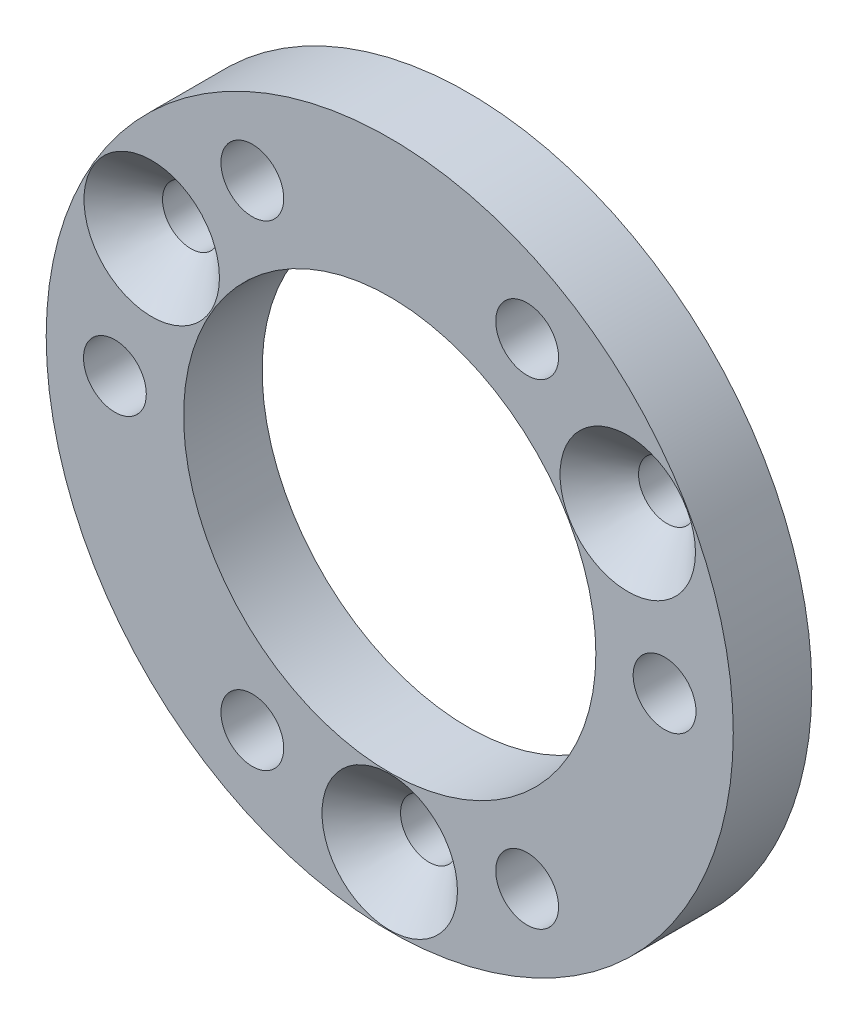
ISO-10303-21;
HEADER;
FILE_DESCRIPTION(('STEP AP214'),'2;1');
FILE_NAME('part.step','',(''),(''),'','','');
FILE_SCHEMA(('AUTOMOTIVE_DESIGN { 1 0 10303 214 1 1 1 1 }'));
ENDSEC;
DATA;
#1=APPLICATION_CONTEXT('core data for automotive mechanical design processes');
#2=APPLICATION_PROTOCOL_DEFINITION('international standard','automotive_design',2000,#1);
#3=PRODUCT_CONTEXT('',#1,'mechanical');
#4=PRODUCT('Part','Part','',(#3));
#5=PRODUCT_RELATED_PRODUCT_CATEGORY('part','',(#4));
#6=PRODUCT_DEFINITION_FORMATION('','',#4);
#7=PRODUCT_DEFINITION_CONTEXT('part definition',#1,'design');
#8=PRODUCT_DEFINITION('design','',#6,#7);
#9=PRODUCT_DEFINITION_SHAPE('','',#8);
#10=(LENGTH_UNIT() NAMED_UNIT(*) SI_UNIT(.MILLI.,.METRE.));
#11=(NAMED_UNIT(*) PLANE_ANGLE_UNIT() SI_UNIT($,.RADIAN.));
#12=(NAMED_UNIT(*) SI_UNIT($,.STERADIAN.) SOLID_ANGLE_UNIT());
#13=UNCERTAINTY_MEASURE_WITH_UNIT(LENGTH_MEASURE(1.E-05),#10,'distance_accuracy_value','');
#14=(GEOMETRIC_REPRESENTATION_CONTEXT(3) GLOBAL_UNCERTAINTY_ASSIGNED_CONTEXT((#13)) GLOBAL_UNIT_ASSIGNED_CONTEXT((#10,
#11,#12)) REPRESENTATION_CONTEXT('',''));
#15=CARTESIAN_POINT('',(0.,0.,0.));
#16=DIRECTION('',(0.,0.,1.));
#17=DIRECTION('',(1.,0.,0.));
#18=AXIS2_PLACEMENT_3D('',#15,#16,#17);
#19=CARTESIAN_POINT('',(0.,0.,4.));
#20=DIRECTION('',(0.,0.,-1.));
#21=DIRECTION('',(-1.,0.,0.));
#22=AXIS2_PLACEMENT_3D('',#19,#20,#21);
#23=CYLINDRICAL_SURFACE('',#22,17.5);
#24=CARTESIAN_POINT('',(0.,0.,4.));
#25=DIRECTION('',(0.,0.,1.));
#26=DIRECTION('',(1.,0.,0.));
#27=AXIS2_PLACEMENT_3D('',#24,#25,#26);
#28=CIRCLE('',#27,17.5);
#29=CARTESIAN_POINT('',(17.5,0.,4.));
#30=VERTEX_POINT('',#29);
#31=EDGE_CURVE('E72',#30,#30,#28,.T.);
#32=ORIENTED_EDGE('',*,*,#31,.F.);
#33=EDGE_LOOP('',(#32));
#34=FACE_BOUND('',#33,.T.);
#35=CARTESIAN_POINT('',(0.,0.,0.));
#36=DIRECTION('',(0.,0.,1.));
#37=DIRECTION('',(1.,0.,0.));
#38=AXIS2_PLACEMENT_3D('',#35,#36,#37);
#39=CIRCLE('',#38,17.5);
#40=CARTESIAN_POINT('',(17.5,0.,0.));
#41=VERTEX_POINT('',#40);
#42=EDGE_CURVE('E73',#41,#41,#39,.T.);
#43=ORIENTED_EDGE('',*,*,#42,.T.);
#44=EDGE_LOOP('',(#43));
#45=FACE_BOUND('',#44,.T.);
#46=ADVANCED_FACE('F39',(#34,#45),#23,.T.);
#47=CARTESIAN_POINT('',(0.,0.,4.));
#48=DIRECTION('',(0.,0.,1.));
#49=DIRECTION('',(1.,0.,0.));
#50=AXIS2_PLACEMENT_3D('',#47,#48,#49);
#51=PLANE('',#50);
#52=CARTESIAN_POINT('',(-12.1243556529822,6.99999999999762,4.));
#53=DIRECTION('',(0.,0.,1.));
#54=DIRECTION('',(1.,0.,0.));
#55=AXIS2_PLACEMENT_3D('',#52,#53,#54);
#56=CIRCLE('',#55,3.45000000000165);
#57=CARTESIAN_POINT('',(-8.67435565298051,6.99999999999762,4.));
#58=VERTEX_POINT('',#57);
#59=EDGE_CURVE('E53',#58,#58,#56,.F.);
#60=ORIENTED_EDGE('',*,*,#59,.T.);
#61=EDGE_LOOP('',(#60));
#62=FACE_BOUND('',#61,.T.);
#63=CARTESIAN_POINT('',(2.05615353129625E-12,-14.0000000000012,4.));
#64=DIRECTION('',(0.,0.,1.));
#65=DIRECTION('',(1.,0.,0.));
#66=AXIS2_PLACEMENT_3D('',#63,#64,#65);
#67=CIRCLE('',#66,3.44999999999932);
#68=CARTESIAN_POINT('',(3.45000000000138,-14.0000000000012,4.));
#69=VERTEX_POINT('',#68);
#70=EDGE_CURVE('E58',#69,#69,#67,.F.);
#71=ORIENTED_EDGE('',*,*,#70,.T.);
#72=EDGE_LOOP('',(#71));
#73=FACE_BOUND('',#72,.T.);
#74=CARTESIAN_POINT('',(12.1243556529821,7.00000000000002,4.));
#75=DIRECTION('',(0.,0.,1.));
#76=DIRECTION('',(1.,0.,0.));
#77=AXIS2_PLACEMENT_3D('',#74,#75,#76);
#78=CIRCLE('',#77,3.45000000000002);
#79=CARTESIAN_POINT('',(15.5743556529821,7.00000000000002,4.));
#80=VERTEX_POINT('',#79);
#81=EDGE_CURVE('E64',#80,#80,#78,.F.);
#82=ORIENTED_EDGE('',*,*,#81,.T.);
#83=EDGE_LOOP('',(#82));
#84=FACE_BOUND('',#83,.T.);
#85=CARTESIAN_POINT('',(14.,0.,4.));
#86=DIRECTION('',(0.,0.,1.));
#87=DIRECTION('',(1.,0.,0.));
#88=AXIS2_PLACEMENT_3D('',#85,#86,#87);
#89=CIRCLE('',#88,1.6);
#90=CARTESIAN_POINT('',(15.6,0.,4.));
#91=VERTEX_POINT('',#90);
#92=EDGE_CURVE('E122',#91,#91,#89,.T.);
#93=ORIENTED_EDGE('',*,*,#92,.F.);
#94=EDGE_LOOP('',(#93));
#95=FACE_BOUND('',#94,.T.);
#96=CARTESIAN_POINT('',(7.00000000000014,12.1243556529821,4.));
#97=DIRECTION('',(0.,0.,1.));
#98=DIRECTION('',(1.,0.,0.));
#99=AXIS2_PLACEMENT_3D('',#96,#97,#98);
#100=CIRCLE('',#99,1.6);
#101=CARTESIAN_POINT('',(8.60000000000014,12.1243556529821,4.));
#102=VERTEX_POINT('',#101);
#103=EDGE_CURVE('E123',#102,#102,#100,.T.);
#104=ORIENTED_EDGE('',*,*,#103,.F.);
#105=EDGE_LOOP('',(#104));
#106=FACE_BOUND('',#105,.T.);
#107=CARTESIAN_POINT('',(-6.99999999999989,12.1243556529822,4.));
#108=DIRECTION('',(0.,0.,1.));
#109=DIRECTION('',(1.,0.,0.));
#110=AXIS2_PLACEMENT_3D('',#107,#108,#109);
#111=CIRCLE('',#110,1.6);
#112=CARTESIAN_POINT('',(-5.39999999999989,12.1243556529822,4.));
#113=VERTEX_POINT('',#112);
#114=EDGE_CURVE('E89',#113,#113,#111,.T.);
#115=ORIENTED_EDGE('',*,*,#114,.F.);
#116=EDGE_LOOP('',(#115));
#117=FACE_BOUND('',#116,.T.);
#118=CARTESIAN_POINT('',(-14.,0.,4.));
#119=DIRECTION('',(0.,0.,1.));
#120=DIRECTION('',(1.,0.,0.));
#121=AXIS2_PLACEMENT_3D('',#118,#119,#120);
#122=CIRCLE('',#121,1.6);
#123=CARTESIAN_POINT('',(-12.4,0.,4.));
#124=VERTEX_POINT('',#123);
#125=EDGE_CURVE('E98',#124,#124,#122,.T.);
#126=ORIENTED_EDGE('',*,*,#125,.F.);
#127=EDGE_LOOP('',(#126));
#128=FACE_BOUND('',#127,.T.);
#129=CARTESIAN_POINT('',(-7.00000000000006,-12.1243556529821,4.));
#130=DIRECTION('',(0.,0.,1.));
#131=DIRECTION('',(1.,0.,0.));
#132=AXIS2_PLACEMENT_3D('',#129,#130,#131);
#133=CIRCLE('',#132,1.6);
#134=CARTESIAN_POINT('',(-5.40000000000006,-12.1243556529821,4.));
#135=VERTEX_POINT('',#134);
#136=EDGE_CURVE('E106',#135,#135,#133,.T.);
#137=ORIENTED_EDGE('',*,*,#136,.F.);
#138=EDGE_LOOP('',(#137));
#139=FACE_BOUND('',#138,.T.);
#140=CARTESIAN_POINT('',(6.99999999999997,-12.1243556529822,4.));
#141=DIRECTION('',(0.,0.,1.));
#142=DIRECTION('',(1.,0.,0.));
#143=AXIS2_PLACEMENT_3D('',#140,#141,#142);
#144=CIRCLE('',#143,1.6);
#145=CARTESIAN_POINT('',(8.59999999999997,-12.1243556529822,4.));
#146=VERTEX_POINT('',#145);
#147=EDGE_CURVE('E114',#146,#146,#144,.T.);
#148=ORIENTED_EDGE('',*,*,#147,.F.);
#149=EDGE_LOOP('',(#148));
#150=FACE_BOUND('',#149,.T.);
#151=CARTESIAN_POINT('',(0.,0.,4.));
#152=DIRECTION('',(0.,0.,1.));
#153=DIRECTION('',(1.,0.,0.));
#154=AXIS2_PLACEMENT_3D('',#151,#152,#153);
#155=CIRCLE('',#154,10.5);
#156=CARTESIAN_POINT('',(10.5,0.,4.));
#157=VERTEX_POINT('',#156);
#158=EDGE_CURVE('E81',#157,#157,#155,.T.);
#159=ORIENTED_EDGE('',*,*,#158,.F.);
#160=EDGE_LOOP('',(#159));
#161=FACE_BOUND('',#160,.T.);
#162=ORIENTED_EDGE('',*,*,#31,.T.);
#163=EDGE_LOOP('',(#162));
#164=FACE_BOUND('',#163,.T.);
#165=ADVANCED_FACE('F167',(#62,#73,#84,#95,#106,#117,#128,#139,#150,#161,#164),#51,.T.);
#166=CARTESIAN_POINT('',(0.,0.,0.));
#167=DIRECTION('',(0.,0.,1.));
#168=DIRECTION('',(1.,0.,0.));
#169=AXIS2_PLACEMENT_3D('',#166,#167,#168);
#170=PLANE('',#169);
#171=CARTESIAN_POINT('',(12.1243556529821,7.00000000000002,0.));
#172=DIRECTION('',(0.,0.,1.));
#173=DIRECTION('',(1.,0.,0.));
#174=AXIS2_PLACEMENT_3D('',#171,#172,#173);
#175=CIRCLE('',#174,1.45);
#176=CARTESIAN_POINT('',(13.5743556529821,7.00000000000002,0.));
#177=VERTEX_POINT('',#176);
#178=EDGE_CURVE('E127',#177,#177,#175,.T.);
#179=ORIENTED_EDGE('',*,*,#178,.T.);
#180=EDGE_LOOP('',(#179));
#181=FACE_BOUND('',#180,.T.);
#182=CARTESIAN_POINT('',(2.05615353129625E-12,-14.0000000000012,0.));
#183=DIRECTION('',(0.,0.,1.));
#184=DIRECTION('',(1.,0.,0.));
#185=AXIS2_PLACEMENT_3D('',#182,#183,#184);
#186=CIRCLE('',#185,1.4499999999993);
#187=CARTESIAN_POINT('',(1.45000000000136,-14.0000000000012,0.));
#188=VERTEX_POINT('',#187);
#189=EDGE_CURVE('E141',#188,#188,#186,.T.);
#190=ORIENTED_EDGE('',*,*,#189,.T.);
#191=EDGE_LOOP('',(#190));
#192=FACE_BOUND('',#191,.T.);
#193=CARTESIAN_POINT('',(-12.1243556529822,6.99999999999762,0.));
#194=DIRECTION('',(0.,0.,1.));
#195=DIRECTION('',(1.,0.,0.));
#196=AXIS2_PLACEMENT_3D('',#193,#194,#195);
#197=CIRCLE('',#196,1.45000000000164);
#198=CARTESIAN_POINT('',(-10.6743556529805,6.99999999999762,0.));
#199=VERTEX_POINT('',#198);
#200=EDGE_CURVE('E137',#199,#199,#197,.T.);
#201=ORIENTED_EDGE('',*,*,#200,.T.);
#202=EDGE_LOOP('',(#201));
#203=FACE_BOUND('',#202,.T.);
#204=CARTESIAN_POINT('',(14.,0.,0.));
#205=DIRECTION('',(0.,0.,1.));
#206=DIRECTION('',(1.,0.,0.));
#207=AXIS2_PLACEMENT_3D('',#204,#205,#206);
#208=CIRCLE('',#207,1.6);
#209=CARTESIAN_POINT('',(15.6,0.,0.));
#210=VERTEX_POINT('',#209);
#211=EDGE_CURVE('E85',#210,#210,#208,.T.);
#212=ORIENTED_EDGE('',*,*,#211,.T.);
#213=EDGE_LOOP('',(#212));
#214=FACE_BOUND('',#213,.T.);
#215=CARTESIAN_POINT('',(7.00000000000014,12.1243556529821,0.));
#216=DIRECTION('',(0.,0.,1.));
#217=DIRECTION('',(1.,0.,0.));
#218=AXIS2_PLACEMENT_3D('',#215,#216,#217);
#219=CIRCLE('',#218,1.6);
#220=CARTESIAN_POINT('',(8.60000000000014,12.1243556529821,0.));
#221=VERTEX_POINT('',#220);
#222=EDGE_CURVE('E94',#221,#221,#219,.T.);
#223=ORIENTED_EDGE('',*,*,#222,.T.);
#224=EDGE_LOOP('',(#223));
#225=FACE_BOUND('',#224,.T.);
#226=CARTESIAN_POINT('',(-6.99999999999989,12.1243556529822,0.));
#227=DIRECTION('',(0.,0.,1.));
#228=DIRECTION('',(1.,0.,0.));
#229=AXIS2_PLACEMENT_3D('',#226,#227,#228);
#230=CIRCLE('',#229,1.6);
#231=CARTESIAN_POINT('',(-5.39999999999989,12.1243556529822,0.));
#232=VERTEX_POINT('',#231);
#233=EDGE_CURVE('E93',#232,#232,#230,.T.);
#234=ORIENTED_EDGE('',*,*,#233,.T.);
#235=EDGE_LOOP('',(#234));
#236=FACE_BOUND('',#235,.T.);
#237=CARTESIAN_POINT('',(-14.,0.,0.));
#238=DIRECTION('',(0.,0.,1.));
#239=DIRECTION('',(1.,0.,0.));
#240=AXIS2_PLACEMENT_3D('',#237,#238,#239);
#241=CIRCLE('',#240,1.6);
#242=CARTESIAN_POINT('',(-12.4,0.,0.));
#243=VERTEX_POINT('',#242);
#244=EDGE_CURVE('E102',#243,#243,#241,.T.);
#245=ORIENTED_EDGE('',*,*,#244,.T.);
#246=EDGE_LOOP('',(#245));
#247=FACE_BOUND('',#246,.T.);
#248=CARTESIAN_POINT('',(-7.00000000000006,-12.1243556529821,0.));
#249=DIRECTION('',(0.,0.,1.));
#250=DIRECTION('',(1.,0.,0.));
#251=AXIS2_PLACEMENT_3D('',#248,#249,#250);
#252=CIRCLE('',#251,1.6);
#253=CARTESIAN_POINT('',(-5.40000000000006,-12.1243556529821,0.));
#254=VERTEX_POINT('',#253);
#255=EDGE_CURVE('E110',#254,#254,#252,.T.);
#256=ORIENTED_EDGE('',*,*,#255,.T.);
#257=EDGE_LOOP('',(#256));
#258=FACE_BOUND('',#257,.T.);
#259=CARTESIAN_POINT('',(6.99999999999997,-12.1243556529822,0.));
#260=DIRECTION('',(0.,0.,1.));
#261=DIRECTION('',(1.,0.,0.));
#262=AXIS2_PLACEMENT_3D('',#259,#260,#261);
#263=CIRCLE('',#262,1.6);
#264=CARTESIAN_POINT('',(8.59999999999997,-12.1243556529822,0.));
#265=VERTEX_POINT('',#264);
#266=EDGE_CURVE('E118',#265,#265,#263,.T.);
#267=ORIENTED_EDGE('',*,*,#266,.T.);
#268=EDGE_LOOP('',(#267));
#269=FACE_BOUND('',#268,.T.);
#270=CARTESIAN_POINT('',(0.,0.,0.));
#271=DIRECTION('',(0.,0.,1.));
#272=DIRECTION('',(1.,0.,0.));
#273=AXIS2_PLACEMENT_3D('',#270,#271,#272);
#274=CIRCLE('',#273,10.5);
#275=CARTESIAN_POINT('',(10.5,0.,0.));
#276=VERTEX_POINT('',#275);
#277=EDGE_CURVE('E77',#276,#276,#274,.T.);
#278=ORIENTED_EDGE('',*,*,#277,.T.);
#279=EDGE_LOOP('',(#278));
#280=FACE_BOUND('',#279,.T.);
#281=ORIENTED_EDGE('',*,*,#42,.F.);
#282=EDGE_LOOP('',(#281));
#283=FACE_BOUND('',#282,.T.);
#284=ADVANCED_FACE('F149',(#181,#192,#203,#214,#225,#236,#247,#258,#269,#280,#283),#170,.F.);
#285=CARTESIAN_POINT('',(0.,0.,0.));
#286=DIRECTION('',(0.,0.,1.));
#287=DIRECTION('',(1.,0.,0.));
#288=AXIS2_PLACEMENT_3D('',#285,#286,#287);
#289=CYLINDRICAL_SURFACE('',#288,10.5);
#290=ORIENTED_EDGE('',*,*,#277,.F.);
#291=EDGE_LOOP('',(#290));
#292=FACE_BOUND('',#291,.T.);
#293=ORIENTED_EDGE('',*,*,#158,.T.);
#294=EDGE_LOOP('',(#293));
#295=FACE_BOUND('',#294,.T.);
#296=ADVANCED_FACE('F211',(#292,#295),#289,.F.);
#297=CARTESIAN_POINT('',(6.99999999999997,-12.1243556529822,0.));
#298=DIRECTION('',(0.,0.,1.));
#299=DIRECTION('',(1.,0.,0.));
#300=AXIS2_PLACEMENT_3D('',#297,#298,#299);
#301=CYLINDRICAL_SURFACE('',#300,1.6);
#302=ORIENTED_EDGE('',*,*,#266,.F.);
#303=EDGE_LOOP('',(#302));
#304=FACE_BOUND('',#303,.T.);
#305=ORIENTED_EDGE('',*,*,#147,.T.);
#306=EDGE_LOOP('',(#305));
#307=FACE_BOUND('',#306,.T.);
#308=ADVANCED_FACE('F213',(#304,#307),#301,.F.);
#309=CARTESIAN_POINT('',(-7.00000000000006,-12.1243556529821,0.));
#310=DIRECTION('',(0.,0.,1.));
#311=DIRECTION('',(1.,0.,0.));
#312=AXIS2_PLACEMENT_3D('',#309,#310,#311);
#313=CYLINDRICAL_SURFACE('',#312,1.6);
#314=ORIENTED_EDGE('',*,*,#255,.F.);
#315=EDGE_LOOP('',(#314));
#316=FACE_BOUND('',#315,.T.);
#317=ORIENTED_EDGE('',*,*,#136,.T.);
#318=EDGE_LOOP('',(#317));
#319=FACE_BOUND('',#318,.T.);
#320=ADVANCED_FACE('F220',(#316,#319),#313,.F.);
#321=CARTESIAN_POINT('',(-14.,0.,0.));
#322=DIRECTION('',(0.,0.,1.));
#323=DIRECTION('',(1.,0.,0.));
#324=AXIS2_PLACEMENT_3D('',#321,#322,#323);
#325=CYLINDRICAL_SURFACE('',#324,1.6);
#326=ORIENTED_EDGE('',*,*,#244,.F.);
#327=EDGE_LOOP('',(#326));
#328=FACE_BOUND('',#327,.T.);
#329=ORIENTED_EDGE('',*,*,#125,.T.);
#330=EDGE_LOOP('',(#329));
#331=FACE_BOUND('',#330,.T.);
#332=ADVANCED_FACE('F229',(#328,#331),#325,.F.);
#333=CARTESIAN_POINT('',(-6.99999999999989,12.1243556529822,0.));
#334=DIRECTION('',(0.,0.,1.));
#335=DIRECTION('',(1.,0.,0.));
#336=AXIS2_PLACEMENT_3D('',#333,#334,#335);
#337=CYLINDRICAL_SURFACE('',#336,1.6);
#338=ORIENTED_EDGE('',*,*,#233,.F.);
#339=EDGE_LOOP('',(#338));
#340=FACE_BOUND('',#339,.T.);
#341=ORIENTED_EDGE('',*,*,#114,.T.);
#342=EDGE_LOOP('',(#341));
#343=FACE_BOUND('',#342,.T.);
#344=ADVANCED_FACE('F225',(#340,#343),#337,.F.);
#345=CARTESIAN_POINT('',(7.00000000000014,12.1243556529821,0.));
#346=DIRECTION('',(0.,0.,1.));
#347=DIRECTION('',(1.,0.,0.));
#348=AXIS2_PLACEMENT_3D('',#345,#346,#347);
#349=CYLINDRICAL_SURFACE('',#348,1.6);
#350=ORIENTED_EDGE('',*,*,#222,.F.);
#351=EDGE_LOOP('',(#350));
#352=FACE_BOUND('',#351,.T.);
#353=ORIENTED_EDGE('',*,*,#103,.T.);
#354=EDGE_LOOP('',(#353));
#355=FACE_BOUND('',#354,.T.);
#356=ADVANCED_FACE('F228',(#352,#355),#349,.F.);
#357=CARTESIAN_POINT('',(14.,0.,0.));
#358=DIRECTION('',(0.,0.,1.));
#359=DIRECTION('',(1.,0.,0.));
#360=AXIS2_PLACEMENT_3D('',#357,#358,#359);
#361=CYLINDRICAL_SURFACE('',#360,1.6);
#362=ORIENTED_EDGE('',*,*,#211,.F.);
#363=EDGE_LOOP('',(#362));
#364=FACE_BOUND('',#363,.T.);
#365=ORIENTED_EDGE('',*,*,#92,.T.);
#366=EDGE_LOOP('',(#365));
#367=FACE_BOUND('',#366,.T.);
#368=ADVANCED_FACE('F239',(#364,#367),#361,.F.);
#369=CARTESIAN_POINT('',(-12.1243556529822,6.99999999999762,0.));
#370=DIRECTION('',(0.,0.,1.));
#371=DIRECTION('',(1.,0.,0.));
#372=AXIS2_PLACEMENT_3D('',#369,#370,#371);
#373=CYLINDRICAL_SURFACE('',#372,1.45000000000164);
#374=CARTESIAN_POINT('',(-12.1243556529822,6.99999999999762,1.99999999999999));
#375=DIRECTION('',(0.,0.,1.));
#376=DIRECTION('',(1.,0.,0.));
#377=AXIS2_PLACEMENT_3D('',#374,#375,#376);
#378=CIRCLE('',#377,1.45000000000164);
#379=CARTESIAN_POINT('',(-10.6743556529805,6.99999999999762,1.99999999999999));
#380=VERTEX_POINT('',#379);
#381=EDGE_CURVE('E68',#380,#380,#378,.T.);
#382=ORIENTED_EDGE('',*,*,#381,.T.);
#383=EDGE_LOOP('',(#382));
#384=FACE_BOUND('',#383,.T.);
#385=ORIENTED_EDGE('',*,*,#200,.F.);
#386=EDGE_LOOP('',(#385));
#387=FACE_BOUND('',#386,.T.);
#388=ADVANCED_FACE('F164',(#384,#387),#373,.F.);
#389=CARTESIAN_POINT('',(2.05615353129625E-12,-14.0000000000012,0.));
#390=DIRECTION('',(0.,0.,1.));
#391=DIRECTION('',(1.,0.,0.));
#392=AXIS2_PLACEMENT_3D('',#389,#390,#391);
#393=CYLINDRICAL_SURFACE('',#392,1.4499999999993);
#394=CARTESIAN_POINT('',(2.05615353129625E-12,-14.0000000000012,1.99999999999999));
#395=DIRECTION('',(0.,0.,1.));
#396=DIRECTION('',(1.,0.,0.));
#397=AXIS2_PLACEMENT_3D('',#394,#395,#396);
#398=CIRCLE('',#397,1.4499999999993);
#399=CARTESIAN_POINT('',(1.45000000000136,-14.0000000000012,1.99999999999999));
#400=VERTEX_POINT('',#399);
#401=EDGE_CURVE('E48',#400,#400,#398,.T.);
#402=ORIENTED_EDGE('',*,*,#401,.T.);
#403=EDGE_LOOP('',(#402));
#404=FACE_BOUND('',#403,.T.);
#405=ORIENTED_EDGE('',*,*,#189,.F.);
#406=EDGE_LOOP('',(#405));
#407=FACE_BOUND('',#406,.T.);
#408=ADVANCED_FACE('F155',(#404,#407),#393,.F.);
#409=CARTESIAN_POINT('',(12.1243556529821,7.00000000000002,0.));
#410=DIRECTION('',(0.,0.,1.));
#411=DIRECTION('',(1.,0.,0.));
#412=AXIS2_PLACEMENT_3D('',#409,#410,#411);
#413=CYLINDRICAL_SURFACE('',#412,1.45);
#414=CARTESIAN_POINT('',(12.1243556529821,7.00000000000002,1.99999999999999));
#415=DIRECTION('',(0.,0.,1.));
#416=DIRECTION('',(1.,0.,0.));
#417=AXIS2_PLACEMENT_3D('',#414,#415,#416);
#418=CIRCLE('',#417,1.45);
#419=CARTESIAN_POINT('',(13.5743556529821,7.00000000000002,1.99999999999999));
#420=VERTEX_POINT('',#419);
#421=EDGE_CURVE('E10',#420,#420,#418,.T.);
#422=ORIENTED_EDGE('',*,*,#421,.T.);
#423=EDGE_LOOP('',(#422));
#424=FACE_BOUND('',#423,.T.);
#425=ORIENTED_EDGE('',*,*,#178,.F.);
#426=EDGE_LOOP('',(#425));
#427=FACE_BOUND('',#426,.T.);
#428=ADVANCED_FACE('F152',(#424,#427),#413,.F.);
#429=CARTESIAN_POINT('',(-12.1243556529822,6.99999999999762,1.99999999999999));
#430=DIRECTION('',(0.,0.,1.));
#431=DIRECTION('',(1.,0.,0.));
#432=AXIS2_PLACEMENT_3D('',#429,#430,#431);
#433=CONICAL_SURFACE('',#432,1.45000000000164,0.785398163397448);
#434=ORIENTED_EDGE('',*,*,#59,.F.);
#435=EDGE_LOOP('',(#434));
#436=FACE_BOUND('',#435,.T.);
#437=ORIENTED_EDGE('',*,*,#381,.F.);
#438=EDGE_LOOP('',(#437));
#439=FACE_BOUND('',#438,.T.);
#440=ADVANCED_FACE('F154',(#436,#439),#433,.F.);
#441=CARTESIAN_POINT('',(2.05615353129625E-12,-14.0000000000012,1.99999999999999));
#442=DIRECTION('',(0.,0.,1.));
#443=DIRECTION('',(1.,0.,0.));
#444=AXIS2_PLACEMENT_3D('',#441,#442,#443);
#445=CONICAL_SURFACE('',#444,1.4499999999993,0.78539816339745);
#446=ORIENTED_EDGE('',*,*,#70,.F.);
#447=EDGE_LOOP('',(#446));
#448=FACE_BOUND('',#447,.T.);
#449=ORIENTED_EDGE('',*,*,#401,.F.);
#450=EDGE_LOOP('',(#449));
#451=FACE_BOUND('',#450,.T.);
#452=ADVANCED_FACE('F161',(#448,#451),#445,.F.);
#453=CARTESIAN_POINT('',(12.1243556529821,7.00000000000002,1.99999999999999));
#454=DIRECTION('',(0.,0.,1.));
#455=DIRECTION('',(1.,0.,0.));
#456=AXIS2_PLACEMENT_3D('',#453,#454,#455);
#457=CONICAL_SURFACE('',#456,1.45,0.78539816339745);
#458=ORIENTED_EDGE('',*,*,#81,.F.);
#459=EDGE_LOOP('',(#458));
#460=FACE_BOUND('',#459,.T.);
#461=ORIENTED_EDGE('',*,*,#421,.F.);
#462=EDGE_LOOP('',(#461));
#463=FACE_BOUND('',#462,.T.);
#464=ADVANCED_FACE('F42',(#460,#463),#457,.F.);
#465=CLOSED_SHELL('',(#46,#165,#284,#296,#308,#320,#332,#344,#356,#368,#388,#408,#428,#440,#452,#464));
#466=MANIFOLD_SOLID_BREP('B2',#465);
#467=ADVANCED_BREP_SHAPE_REPRESENTATION('',(#18,#466),#14);
#468=SHAPE_DEFINITION_REPRESENTATION(#9,#467);
ENDSEC;
END-ISO-10303-21;
